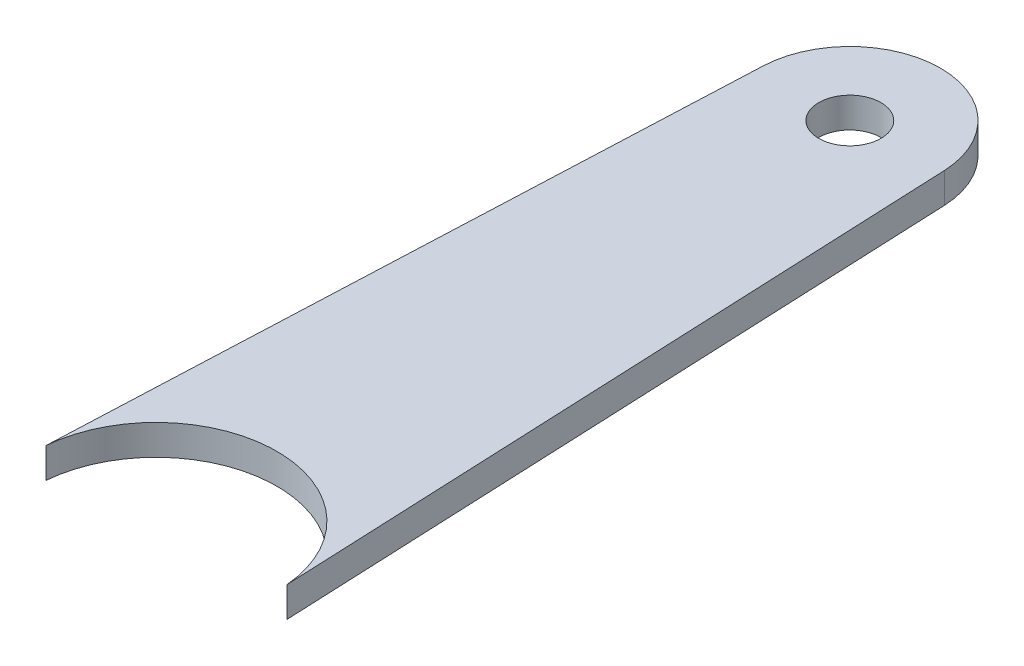
ISO-10303-21;
HEADER;
FILE_DESCRIPTION(('STEP AP214'),'2;1');
FILE_NAME('part.step','',(''),(''),'','','');
FILE_SCHEMA(('AUTOMOTIVE_DESIGN { 1 0 10303 214 1 1 1 1 }'));
ENDSEC;
DATA;
#1=APPLICATION_CONTEXT('core data for automotive mechanical design processes');
#2=APPLICATION_PROTOCOL_DEFINITION('international standard','automotive_design',2000,#1);
#3=PRODUCT_CONTEXT('',#1,'mechanical');
#4=PRODUCT('Part','Part','',(#3));
#5=PRODUCT_RELATED_PRODUCT_CATEGORY('part','',(#4));
#6=PRODUCT_DEFINITION_FORMATION('','',#4);
#7=PRODUCT_DEFINITION_CONTEXT('part definition',#1,'design');
#8=PRODUCT_DEFINITION('design','',#6,#7);
#9=PRODUCT_DEFINITION_SHAPE('','',#8);
#10=(LENGTH_UNIT() NAMED_UNIT(*) SI_UNIT(.MILLI.,.METRE.));
#11=(NAMED_UNIT(*) PLANE_ANGLE_UNIT() SI_UNIT($,.RADIAN.));
#12=(NAMED_UNIT(*) SI_UNIT($,.STERADIAN.) SOLID_ANGLE_UNIT());
#13=UNCERTAINTY_MEASURE_WITH_UNIT(LENGTH_MEASURE(1.E-05),#10,'distance_accuracy_value','');
#14=(GEOMETRIC_REPRESENTATION_CONTEXT(3) GLOBAL_UNCERTAINTY_ASSIGNED_CONTEXT((#13)) GLOBAL_UNIT_ASSIGNED_CONTEXT((#10,
#11,#12)) REPRESENTATION_CONTEXT('',''));
#15=CARTESIAN_POINT('',(0.,0.,0.));
#16=DIRECTION('',(0.,0.,1.));
#17=DIRECTION('',(1.,0.,0.));
#18=AXIS2_PLACEMENT_3D('',#15,#16,#17);
#19=CARTESIAN_POINT('',(0.,3.175,0.));
#20=DIRECTION('',(-0.999057757052999,0.,-0.0434004386179552));
#21=DIRECTION('',(-0.0434004386179552,0.,0.999057757052999));
#22=AXIS2_PLACEMENT_3D('',#19,#20,#21);
#23=PLANE('',#22);
#24=DIRECTION('',(0.0434004386179552,0.,-0.999057757052999));
#25=VECTOR('',#24,1.);
#26=CARTESIAN_POINT('',(0.,0.,0.));
#27=LINE('',#26,#25);
#28=CARTESIAN_POINT('',(0.0478433910346645,0.,-1.1013324394636));
#29=VERTEX_POINT('',#28);
#30=CARTESIAN_POINT('',(3.18397486407017,0.,-73.293609177836));
#31=VERTEX_POINT('',#30);
#32=EDGE_CURVE('E121',#29,#31,#27,.T.);
#33=ORIENTED_EDGE('',*,*,#32,.F.);
#34=DIRECTION('',(0.,-1.,0.));
#35=VECTOR('',#34,1.);
#36=CARTESIAN_POINT('',(0.0478433910346645,3.175,-1.1013324394636));
#37=LINE('',#36,#35);
#38=CARTESIAN_POINT('',(0.0478433910346645,3.175,-1.1013324394636));
#39=VERTEX_POINT('',#38);
#40=EDGE_CURVE('E11',#39,#29,#37,.T.);
#41=ORIENTED_EDGE('',*,*,#40,.F.);
#42=DIRECTION('',(0.0434004386179552,0.,-0.999057757052999));
#43=VECTOR('',#42,1.);
#44=CARTESIAN_POINT('',(0.,3.175,0.));
#45=LINE('',#44,#43);
#46=CARTESIAN_POINT('',(3.18397486407017,3.175,-73.293609177836));
#47=VERTEX_POINT('',#46);
#48=EDGE_CURVE('E108',#39,#47,#45,.T.);
#49=ORIENTED_EDGE('',*,*,#48,.T.);
#50=DIRECTION('',(0.,-1.,0.));
#51=VECTOR('',#50,1.);
#52=CARTESIAN_POINT('',(3.18397486407017,3.175,-73.293609177836));
#53=LINE('',#52,#51);
#54=EDGE_CURVE('E86',#47,#31,#53,.T.);
#55=ORIENTED_EDGE('',*,*,#54,.T.);
#56=EDGE_LOOP('',(#33,#41,#49,#55));
#57=FACE_BOUND('',#56,.T.);
#58=ADVANCED_FACE('F47',(#57),#23,.T.);
#59=CARTESIAN_POINT('',(12.7,3.175,0.));
#60=DIRECTION('',(0.,-1.,0.));
#61=DIRECTION('',(0.,0.,-1.));
#62=AXIS2_PLACEMENT_3D('',#59,#60,#61);
#63=CYLINDRICAL_SURFACE('',#62,12.7);
#64=CARTESIAN_POINT('',(12.7,0.,0.));
#65=DIRECTION('',(0.,1.,0.));
#66=DIRECTION('',(0.,0.,1.));
#67=AXIS2_PLACEMENT_3D('',#64,#65,#66);
#68=CIRCLE('',#67,12.7);
#69=CARTESIAN_POINT('',(25.3521566089653,0.,-1.10133243946363));
#70=VERTEX_POINT('',#69);
#71=EDGE_CURVE('E99',#70,#29,#68,.T.);
#72=ORIENTED_EDGE('',*,*,#71,.F.);
#73=DIRECTION('',(0.,-1.,0.));
#74=VECTOR('',#73,1.);
#75=CARTESIAN_POINT('',(25.3521566089653,3.175,-1.10133243946363));
#76=LINE('',#75,#74);
#77=CARTESIAN_POINT('',(25.3521566089653,3.175,-1.10133243946363));
#78=VERTEX_POINT('',#77);
#79=EDGE_CURVE('E56',#78,#70,#76,.T.);
#80=ORIENTED_EDGE('',*,*,#79,.F.);
#81=CARTESIAN_POINT('',(12.7,3.175,0.));
#82=DIRECTION('',(0.,1.,0.));
#83=DIRECTION('',(0.,0.,1.));
#84=AXIS2_PLACEMENT_3D('',#81,#82,#83);
#85=CIRCLE('',#84,12.7);
#86=EDGE_CURVE('E97',#78,#39,#85,.T.);
#87=ORIENTED_EDGE('',*,*,#86,.T.);
#88=ORIENTED_EDGE('',*,*,#40,.T.);
#89=EDGE_LOOP('',(#72,#80,#87,#88));
#90=FACE_BOUND('',#89,.T.);
#91=ADVANCED_FACE('F95',(#90),#63,.F.);
#92=CARTESIAN_POINT('',(25.3521566089653,3.175,-1.10133243946358));
#93=DIRECTION('',(-0.999057757052999,0.,0.0434004386179554));
#94=DIRECTION('',(0.0434004386179554,0.,0.999057757052999));
#95=AXIS2_PLACEMENT_3D('',#92,#93,#94);
#96=PLANE('',#95);
#97=DIRECTION('',(-0.0434004386179554,0.,-0.999057757052999));
#98=VECTOR('',#97,1.);
#99=CARTESIAN_POINT('',(25.3521566089653,0.,-1.10133243946358));
#100=LINE('',#99,#98);
#101=CARTESIAN_POINT('',(22.2160251359298,0.,-73.293609177836));
#102=VERTEX_POINT('',#101);
#103=EDGE_CURVE('E79',#70,#102,#100,.T.);
#104=ORIENTED_EDGE('',*,*,#103,.T.);
#105=DIRECTION('',(0.,-1.,0.));
#106=VECTOR('',#105,1.);
#107=CARTESIAN_POINT('',(22.2160251359298,3.175,-73.293609177836));
#108=LINE('',#107,#106);
#109=CARTESIAN_POINT('',(22.2160251359298,3.175,-73.293609177836));
#110=VERTEX_POINT('',#109);
#111=EDGE_CURVE('E101',#110,#102,#108,.T.);
#112=ORIENTED_EDGE('',*,*,#111,.F.);
#113=DIRECTION('',(-0.0434004386179554,0.,-0.999057757052999));
#114=VECTOR('',#113,1.);
#115=CARTESIAN_POINT('',(25.3521566089653,3.175,-1.10133243946358));
#116=LINE('',#115,#114);
#117=EDGE_CURVE('E102',#78,#110,#116,.T.);
#118=ORIENTED_EDGE('',*,*,#117,.F.);
#119=ORIENTED_EDGE('',*,*,#79,.T.);
#120=EDGE_LOOP('',(#104,#112,#118,#119));
#121=FACE_BOUND('',#120,.T.);
#122=ADVANCED_FACE('F103',(#121),#96,.F.);
#123=CARTESIAN_POINT('',(12.7,3.175,-72.88022));
#124=DIRECTION('',(0.,-1.,0.));
#125=DIRECTION('',(0.,0.,-1.));
#126=AXIS2_PLACEMENT_3D('',#123,#124,#125);
#127=CYLINDRICAL_SURFACE('',#126,9.52500000000001);
#128=CARTESIAN_POINT('',(12.7,0.,-72.88022));
#129=DIRECTION('',(0.,1.,0.));
#130=DIRECTION('',(0.,0.,1.));
#131=AXIS2_PLACEMENT_3D('',#128,#129,#130);
#132=CIRCLE('',#131,9.52500000000001);
#133=EDGE_CURVE('E129',#102,#31,#132,.T.);
#134=ORIENTED_EDGE('',*,*,#133,.T.);
#135=ORIENTED_EDGE('',*,*,#54,.F.);
#136=CARTESIAN_POINT('',(12.7,3.175,-72.88022));
#137=DIRECTION('',(0.,1.,0.));
#138=DIRECTION('',(0.,0.,1.));
#139=AXIS2_PLACEMENT_3D('',#136,#137,#138);
#140=CIRCLE('',#139,9.52500000000001);
#141=EDGE_CURVE('E64',#110,#47,#140,.T.);
#142=ORIENTED_EDGE('',*,*,#141,.F.);
#143=ORIENTED_EDGE('',*,*,#111,.T.);
#144=EDGE_LOOP('',(#134,#135,#142,#143));
#145=FACE_BOUND('',#144,.T.);
#146=ADVANCED_FACE('F140',(#145),#127,.T.);
#147=CARTESIAN_POINT('',(12.7,3.175,-72.88022));
#148=DIRECTION('',(0.,-1.,0.));
#149=DIRECTION('',(0.,0.,-1.));
#150=AXIS2_PLACEMENT_3D('',#147,#148,#149);
#151=CYLINDRICAL_SURFACE('',#150,3.2639);
#152=CARTESIAN_POINT('',(12.7,3.175,-72.88022));
#153=DIRECTION('',(0.,1.,0.));
#154=DIRECTION('',(0.,0.,1.));
#155=AXIS2_PLACEMENT_3D('',#152,#153,#154);
#156=CIRCLE('',#155,3.2639);
#157=CARTESIAN_POINT('',(12.7,3.175,-69.61632));
#158=VERTEX_POINT('',#157);
#159=EDGE_CURVE('E117',#158,#158,#156,.T.);
#160=ORIENTED_EDGE('',*,*,#159,.T.);
#161=EDGE_LOOP('',(#160));
#162=FACE_BOUND('',#161,.T.);
#163=CARTESIAN_POINT('',(12.7,0.,-72.88022));
#164=DIRECTION('',(0.,1.,0.));
#165=DIRECTION('',(0.,0.,1.));
#166=AXIS2_PLACEMENT_3D('',#163,#164,#165);
#167=CIRCLE('',#166,3.2639);
#168=CARTESIAN_POINT('',(12.7,0.,-69.61632));
#169=VERTEX_POINT('',#168);
#170=EDGE_CURVE('E112',#169,#169,#167,.T.);
#171=ORIENTED_EDGE('',*,*,#170,.F.);
#172=EDGE_LOOP('',(#171));
#173=FACE_BOUND('',#172,.T.);
#174=ADVANCED_FACE('F155',(#162,#173),#151,.F.);
#175=CARTESIAN_POINT('',(0.,3.175,0.));
#176=DIRECTION('',(0.,1.,0.));
#177=DIRECTION('',(0.,0.,1.));
#178=AXIS2_PLACEMENT_3D('',#175,#176,#177);
#179=PLANE('',#178);
#180=ORIENTED_EDGE('',*,*,#48,.F.);
#181=ORIENTED_EDGE('',*,*,#86,.F.);
#182=ORIENTED_EDGE('',*,*,#117,.T.);
#183=ORIENTED_EDGE('',*,*,#141,.T.);
#184=EDGE_LOOP('',(#180,#181,#182,#183));
#185=FACE_BOUND('',#184,.T.);
#186=ORIENTED_EDGE('',*,*,#159,.F.);
#187=EDGE_LOOP('',(#186));
#188=FACE_BOUND('',#187,.T.);
#189=ADVANCED_FACE('F106',(#185,#188),#179,.T.);
#190=CARTESIAN_POINT('',(0.,0.,0.));
#191=DIRECTION('',(0.,1.,0.));
#192=DIRECTION('',(0.,0.,1.));
#193=AXIS2_PLACEMENT_3D('',#190,#191,#192);
#194=PLANE('',#193);
#195=ORIENTED_EDGE('',*,*,#32,.T.);
#196=ORIENTED_EDGE('',*,*,#133,.F.);
#197=ORIENTED_EDGE('',*,*,#103,.F.);
#198=ORIENTED_EDGE('',*,*,#71,.T.);
#199=EDGE_LOOP('',(#195,#196,#197,#198));
#200=FACE_BOUND('',#199,.T.);
#201=ORIENTED_EDGE('',*,*,#170,.T.);
#202=EDGE_LOOP('',(#201));
#203=FACE_BOUND('',#202,.T.);
#204=ADVANCED_FACE('F142',(#200,#203),#194,.F.);
#205=CLOSED_SHELL('',(#58,#91,#122,#146,#174,#189,#204));
#206=MANIFOLD_SOLID_BREP('B2',#205);
#207=ADVANCED_BREP_SHAPE_REPRESENTATION('',(#18,#206),#14);
#208=SHAPE_DEFINITION_REPRESENTATION(#9,#207);
ENDSEC;
END-ISO-10303-21;
